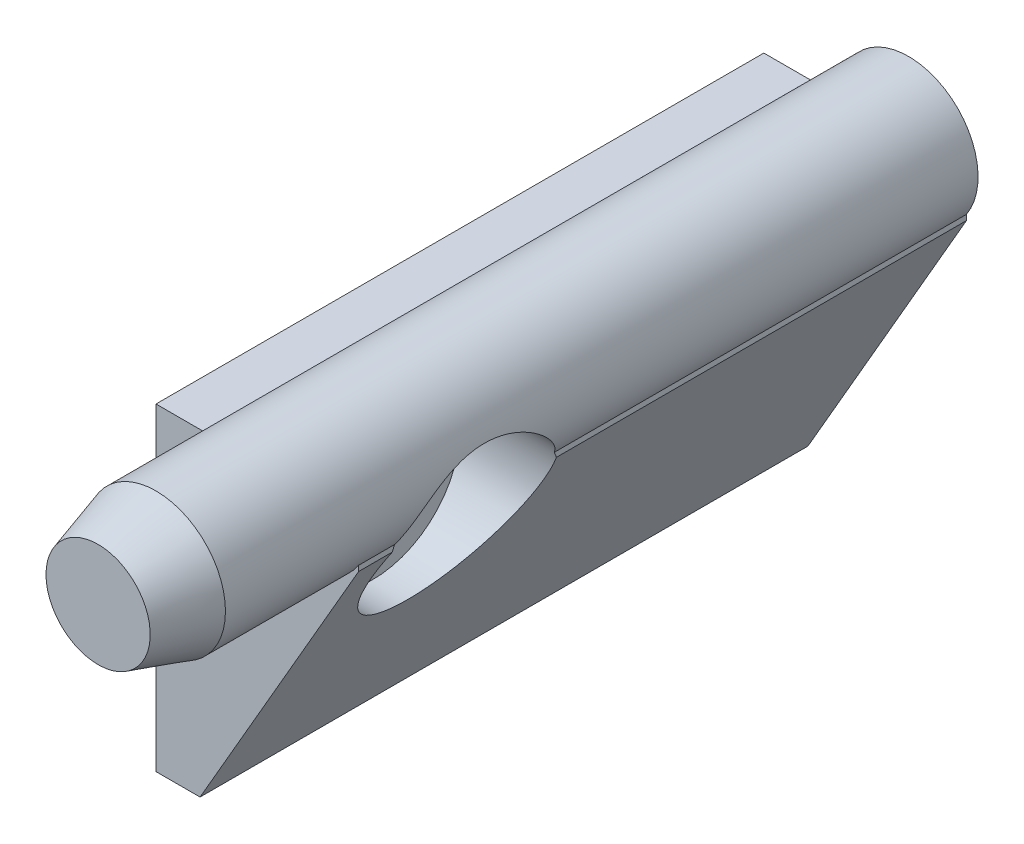
ISO-10303-21;
HEADER;
FILE_DESCRIPTION(('STEP AP214'),'2;1');
FILE_NAME('part.step','',(''),(''),'','','');
FILE_SCHEMA(('AUTOMOTIVE_DESIGN { 1 0 10303 214 1 1 1 1 }'));
ENDSEC;
DATA;
#1=APPLICATION_CONTEXT('core data for automotive mechanical design processes');
#2=APPLICATION_PROTOCOL_DEFINITION('international standard','automotive_design',2000,#1);
#3=PRODUCT_CONTEXT('',#1,'mechanical');
#4=PRODUCT('Part','Part','',(#3));
#5=PRODUCT_RELATED_PRODUCT_CATEGORY('part','',(#4));
#6=PRODUCT_DEFINITION_FORMATION('','',#4);
#7=PRODUCT_DEFINITION_CONTEXT('part definition',#1,'design');
#8=PRODUCT_DEFINITION('design','',#6,#7);
#9=PRODUCT_DEFINITION_SHAPE('','',#8);
#10=(LENGTH_UNIT() NAMED_UNIT(*) SI_UNIT(.MILLI.,.METRE.));
#11=(NAMED_UNIT(*) PLANE_ANGLE_UNIT() SI_UNIT($,.RADIAN.));
#12=(NAMED_UNIT(*) SI_UNIT($,.STERADIAN.) SOLID_ANGLE_UNIT());
#13=UNCERTAINTY_MEASURE_WITH_UNIT(LENGTH_MEASURE(1.E-05),#10,'distance_accuracy_value','');
#14=(GEOMETRIC_REPRESENTATION_CONTEXT(3) GLOBAL_UNCERTAINTY_ASSIGNED_CONTEXT((#13)) GLOBAL_UNIT_ASSIGNED_CONTEXT((#10,
#11,#12)) REPRESENTATION_CONTEXT('',''));
#15=CARTESIAN_POINT('',(0.,0.,0.));
#16=DIRECTION('',(0.,0.,1.));
#17=DIRECTION('',(1.,0.,0.));
#18=AXIS2_PLACEMENT_3D('',#15,#16,#17);
#19=CARTESIAN_POINT('',(-12.5,-2.5,17.));
#20=DIRECTION('',(1.,0.,0.));
#21=DIRECTION('',(0.,0.,-1.));
#22=AXIS2_PLACEMENT_3D('',#19,#20,#21);
#23=CYLINDRICAL_SURFACE('',#22,1.75);
#24=CARTESIAN_POINT('',(-1.5,-2.5,17.));
#25=DIRECTION('',(1.,0.,0.));
#26=DIRECTION('',(0.,0.,-1.));
#27=AXIS2_PLACEMENT_3D('',#24,#25,#26);
#28=CIRCLE('',#27,1.75);
#29=CARTESIAN_POINT('',(-1.5,-2.5,15.25));
#30=VERTEX_POINT('',#29);
#31=EDGE_CURVE('E92',#30,#30,#28,.F.);
#32=ORIENTED_EDGE('',*,*,#31,.F.);
#33=EDGE_LOOP('',(#32));
#34=FACE_BOUND('',#33,.T.);
#35=CARTESIAN_POINT('',(-5.,-2.5,17.));
#36=DIRECTION('',(1.,0.,0.));
#37=DIRECTION('',(0.,0.,-1.));
#38=AXIS2_PLACEMENT_3D('',#35,#36,#37);
#39=CIRCLE('',#38,1.75);
#40=CARTESIAN_POINT('',(-5.,-2.5,15.25));
#41=VERTEX_POINT('',#40);
#42=EDGE_CURVE('E106',#41,#41,#39,.F.);
#43=ORIENTED_EDGE('',*,*,#42,.T.);
#44=EDGE_LOOP('',(#43));
#45=FACE_BOUND('',#44,.T.);
#46=ADVANCED_FACE('F16',(#34,#45),#23,.F.);
#47=CARTESIAN_POINT('',(-5.,-11.,0.));
#48=DIRECTION('',(0.,1.,0.));
#49=DIRECTION('',(0.,0.,1.));
#50=AXIS2_PLACEMENT_3D('',#47,#48,#49);
#51=PLANE('',#50);
#52=DIRECTION('',(1.,0.,0.));
#53=VECTOR('',#52,1.);
#54=CARTESIAN_POINT('',(-5.,-11.,21.));
#55=LINE('',#54,#53);
#56=CARTESIAN_POINT('',(-5.,-11.,21.));
#57=VERTEX_POINT('',#56);
#58=CARTESIAN_POINT('',(-3.47735026918938,-11.0000000000004,21.));
#59=VERTEX_POINT('',#58);
#60=EDGE_CURVE('E74',#57,#59,#55,.T.);
#61=ORIENTED_EDGE('',*,*,#60,.F.);
#62=DIRECTION('',(0.,0.,-1.));
#63=VECTOR('',#62,1.);
#64=CARTESIAN_POINT('',(-5.,-11.,0.));
#65=LINE('',#64,#63);
#66=CARTESIAN_POINT('',(-5.,-11.,0.));
#67=VERTEX_POINT('',#66);
#68=EDGE_CURVE('E107',#57,#67,#65,.T.);
#69=ORIENTED_EDGE('',*,*,#68,.T.);
#70=DIRECTION('',(1.,0.,0.));
#71=VECTOR('',#70,1.);
#72=CARTESIAN_POINT('',(-5.,-11.,0.));
#73=LINE('',#72,#71);
#74=CARTESIAN_POINT('',(-3.47735026918876,-11.0000000000007,0.));
#75=VERTEX_POINT('',#74);
#76=EDGE_CURVE('E73',#67,#75,#73,.T.);
#77=ORIENTED_EDGE('',*,*,#76,.T.);
#78=DIRECTION('',(0.,0.,1.));
#79=VECTOR('',#78,1.);
#80=CARTESIAN_POINT('',(-3.47735026918815,-11.0000000000011,-1.));
#81=LINE('',#80,#79);
#82=EDGE_CURVE('E80',#75,#59,#81,.T.);
#83=ORIENTED_EDGE('',*,*,#82,.T.);
#84=EDGE_LOOP('',(#61,#69,#77,#83));
#85=FACE_BOUND('',#84,.T.);
#86=ADVANCED_FACE('F174',(#85),#51,.F.);
#87=CARTESIAN_POINT('',(2.,-11.,0.));
#88=DIRECTION('',(1.,0.,0.));
#89=DIRECTION('',(0.,0.,-1.));
#90=AXIS2_PLACEMENT_3D('',#87,#88,#89);
#91=PLANE('',#90);
#92=DIRECTION('',(0.,0.,1.));
#93=VECTOR('',#92,1.);
#94=CARTESIAN_POINT('',(2.00000000000007,-1.32664991614205,0.));
#95=LINE('',#94,#93);
#96=CARTESIAN_POINT('',(2.00000000000004,-1.32664991614211,14.2389767149278));
#97=VERTEX_POINT('',#96);
#98=CARTESIAN_POINT('',(2.,-1.32664991614208,0.));
#99=VERTEX_POINT('',#98);
#100=EDGE_CURVE('E60',#97,#99,#95,.F.);
#101=ORIENTED_EDGE('',*,*,#100,.F.);
#102=CARTESIAN_POINT('',(2.,-2.5,17.));
#103=DIRECTION('',(1.,0.,0.));
#104=DIRECTION('',(0.,0.,-1.));
#105=AXIS2_PLACEMENT_3D('',#102,#103,#104);
#106=CIRCLE('',#105,3.);
#107=CARTESIAN_POINT('',(2.00000000000172,-1.51295104291796,14.1670272934031));
#108=VERTEX_POINT('',#107);
#109=EDGE_CURVE('E19',#97,#108,#106,.F.);
#110=ORIENTED_EDGE('',*,*,#109,.T.);
#111=DIRECTION('',(0.,0.,1.));
#112=VECTOR('',#111,1.);
#113=CARTESIAN_POINT('',(2.00000000000343,-1.51295104291498,-1.));
#114=LINE('',#113,#112);
#115=CARTESIAN_POINT('',(2.00000000000229,-1.51295104291432,0.));
#116=VERTEX_POINT('',#115);
#117=EDGE_CURVE('E90',#108,#116,#114,.F.);
#118=ORIENTED_EDGE('',*,*,#117,.T.);
#119=DIRECTION('',(0.,1.,0.));
#120=VECTOR('',#119,1.);
#121=CARTESIAN_POINT('',(2.,-11.,0.));
#122=LINE('',#121,#120);
#123=EDGE_CURVE('E78',#116,#99,#122,.T.);
#124=ORIENTED_EDGE('',*,*,#123,.T.);
#125=EDGE_LOOP('',(#101,#110,#118,#124));
#126=FACE_BOUND('',#125,.T.);
#127=ADVANCED_FACE('F76',(#126),#91,.T.);
#128=CARTESIAN_POINT('',(-5.,-11.,0.));
#129=DIRECTION('',(1.,0.,0.));
#130=DIRECTION('',(0.,0.,-1.));
#131=AXIS2_PLACEMENT_3D('',#128,#129,#130);
#132=PLANE('',#131);
#133=ORIENTED_EDGE('',*,*,#42,.F.);
#134=EDGE_LOOP('',(#133));
#135=FACE_BOUND('',#134,.T.);
#136=DIRECTION('',(0.,0.,1.));
#137=VECTOR('',#136,1.);
#138=CARTESIAN_POINT('',(-5.,0.,0.));
#139=LINE('',#138,#137);
#140=CARTESIAN_POINT('',(-5.,0.,0.));
#141=VERTEX_POINT('',#140);
#142=CARTESIAN_POINT('',(-5.,0.,21.));
#143=VERTEX_POINT('',#142);
#144=EDGE_CURVE('E83',#141,#143,#139,.T.);
#145=ORIENTED_EDGE('',*,*,#144,.F.);
#146=DIRECTION('',(0.,1.,0.));
#147=VECTOR('',#146,1.);
#148=CARTESIAN_POINT('',(-5.,-11.,0.));
#149=LINE('',#148,#147);
#150=EDGE_CURVE('E103',#67,#141,#149,.T.);
#151=ORIENTED_EDGE('',*,*,#150,.F.);
#152=ORIENTED_EDGE('',*,*,#68,.F.);
#153=DIRECTION('',(0.,1.,0.));
#154=VECTOR('',#153,1.);
#155=CARTESIAN_POINT('',(-5.,-11.,21.));
#156=LINE('',#155,#154);
#157=EDGE_CURVE('E96',#143,#57,#156,.F.);
#158=ORIENTED_EDGE('',*,*,#157,.F.);
#159=EDGE_LOOP('',(#145,#151,#152,#158));
#160=FACE_BOUND('',#159,.T.);
#161=ADVANCED_FACE('F168',(#135,#160),#132,.F.);
#162=CARTESIAN_POINT('',(0.,0.,28.));
#163=DIRECTION('',(0.,0.,1.));
#164=DIRECTION('',(1.,0.,0.));
#165=AXIS2_PLACEMENT_3D('',#162,#163,#164);
#166=PLANE('',#165);
#167=CARTESIAN_POINT('',(0.,0.,27.9999999999632));
#168=DIRECTION('',(0.,0.,-1.));
#169=DIRECTION('',(-1.,0.,0.));
#170=AXIS2_PLACEMENT_3D('',#167,#168,#169);
#171=CIRCLE('',#170,1.8000000000427);
#172=CARTESIAN_POINT('',(-1.8000000000427,0.,27.9999999999632));
#173=VERTEX_POINT('',#172);
#174=EDGE_CURVE('E212',#173,#173,#171,.T.);
#175=ORIENTED_EDGE('',*,*,#174,.F.);
#176=EDGE_LOOP('',(#175));
#177=FACE_BOUND('',#176,.T.);
#178=ADVANCED_FACE('F164',(#177),#166,.T.);
#179=CARTESIAN_POINT('',(-1.5,-2.5,17.));
#180=DIRECTION('',(1.,0.,0.));
#181=DIRECTION('',(0.,0.,-1.));
#182=AXIS2_PLACEMENT_3D('',#179,#180,#181);
#183=PLANE('',#182);
#184=ORIENTED_EDGE('',*,*,#31,.T.);
#185=EDGE_LOOP('',(#184));
#186=FACE_BOUND('',#185,.T.);
#187=CARTESIAN_POINT('',(-1.5,-2.5,17.));
#188=DIRECTION('',(1.,0.,0.));
#189=DIRECTION('',(0.,0.,-1.));
#190=AXIS2_PLACEMENT_3D('',#187,#188,#189);
#191=CIRCLE('',#190,3.);
#192=CARTESIAN_POINT('',(-1.5,-2.5,14.));
#193=VERTEX_POINT('',#192);
#194=EDGE_CURVE('E209',#193,#193,#191,.T.);
#195=ORIENTED_EDGE('',*,*,#194,.T.);
#196=EDGE_LOOP('',(#195));
#197=FACE_BOUND('',#196,.T.);
#198=ADVANCED_FACE('F160',(#186,#197),#183,.T.);
#199=CARTESIAN_POINT('',(-7.230127018922,-17.5,-1.));
#200=DIRECTION('',(-0.866025403784329,0.50000000000019,0.));
#201=DIRECTION('',(-0.50000000000019,-0.866025403784329,0.));
#202=AXIS2_PLACEMENT_3D('',#199,#200,#201);
#203=PLANE('',#202);
#204=DIRECTION('',(0.500000000000045,0.866025403784413,0.));
#205=VECTOR('',#204,1.);
#206=CARTESIAN_POINT('',(-3.47735026919,-11.,21.));
#207=LINE('',#206,#205);
#208=CARTESIAN_POINT('',(2.,-1.512951042913,21.));
#209=VERTEX_POINT('',#208);
#210=EDGE_CURVE('E93',#59,#209,#207,.T.);
#211=ORIENTED_EDGE('',*,*,#210,.F.);
#212=ORIENTED_EDGE('',*,*,#82,.F.);
#213=DIRECTION('',(-0.50000000000019,-0.866025403784329,0.));
#214=VECTOR('',#213,1.);
#215=CARTESIAN_POINT('',(-7.230127018922,-17.5,0.));
#216=LINE('',#215,#214);
#217=EDGE_CURVE('E86',#116,#75,#216,.T.);
#218=ORIENTED_EDGE('',*,*,#217,.F.);
#219=ORIENTED_EDGE('',*,*,#117,.F.);
#220=CARTESIAN_POINT('',(1.43012701892677,-2.5,17.));
#221=DIRECTION('',(-0.866025403784329,0.50000000000019,0.));
#222=DIRECTION('',(0.50000000000019,0.866025403784329,0.));
#223=AXIS2_PLACEMENT_3D('',#220,#221,#222);
#224=ELLIPSE('',#223,3.46410161513819,3.);
#225=CARTESIAN_POINT('',(2.,-1.51295104291697,19.8329727065966));
#226=VERTEX_POINT('',#225);
#227=EDGE_CURVE('E69',#108,#226,#224,.T.);
#228=ORIENTED_EDGE('',*,*,#227,.T.);
#229=DIRECTION('',(0.,0.,-1.));
#230=VECTOR('',#229,1.);
#231=CARTESIAN_POINT('',(2.,-1.512951042913,0.));
#232=LINE('',#231,#230);
#233=EDGE_CURVE('E214',#209,#226,#232,.T.);
#234=ORIENTED_EDGE('',*,*,#233,.F.);
#235=EDGE_LOOP('',(#211,#212,#218,#219,#228,#234));
#236=FACE_BOUND('',#235,.T.);
#237=ADVANCED_FACE('F156',(#236),#203,.F.);
#238=CARTESIAN_POINT('',(0.,0.,0.));
#239=DIRECTION('',(0.,0.,1.));
#240=DIRECTION('',(1.,0.,0.));
#241=AXIS2_PLACEMENT_3D('',#238,#239,#240);
#242=PLANE('',#241);
#243=CARTESIAN_POINT('',(0.,0.,0.));
#244=DIRECTION('',(0.,0.,1.));
#245=DIRECTION('',(1.,0.,0.));
#246=AXIS2_PLACEMENT_3D('',#243,#244,#245);
#247=CIRCLE('',#246,2.4);
#248=CARTESIAN_POINT('',(-2.4,0.,0.));
#249=VERTEX_POINT('',#248);
#250=EDGE_CURVE('E205',#99,#249,#247,.T.);
#251=ORIENTED_EDGE('',*,*,#250,.F.);
#252=ORIENTED_EDGE('',*,*,#123,.F.);
#253=ORIENTED_EDGE('',*,*,#217,.T.);
#254=ORIENTED_EDGE('',*,*,#76,.F.);
#255=ORIENTED_EDGE('',*,*,#150,.T.);
#256=DIRECTION('',(1.,0.,0.));
#257=VECTOR('',#256,1.);
#258=CARTESIAN_POINT('',(-5.,0.,0.));
#259=LINE('',#258,#257);
#260=EDGE_CURVE('E79',#249,#141,#259,.F.);
#261=ORIENTED_EDGE('',*,*,#260,.F.);
#262=EDGE_LOOP('',(#251,#252,#253,#254,#255,#261));
#263=FACE_BOUND('',#262,.T.);
#264=ADVANCED_FACE('F152',(#263),#242,.F.);
#265=CARTESIAN_POINT('',(-5.,0.,0.));
#266=DIRECTION('',(0.,1.,0.));
#267=DIRECTION('',(0.,0.,1.));
#268=AXIS2_PLACEMENT_3D('',#265,#266,#267);
#269=PLANE('',#268);
#270=DIRECTION('',(1.,0.,0.));
#271=VECTOR('',#270,1.);
#272=CARTESIAN_POINT('',(-5.,0.,21.));
#273=LINE('',#272,#271);
#274=CARTESIAN_POINT('',(-2.4,0.,21.));
#275=VERTEX_POINT('',#274);
#276=EDGE_CURVE('E100',#275,#143,#273,.F.);
#277=ORIENTED_EDGE('',*,*,#276,.F.);
#278=DIRECTION('',(0.,0.,1.));
#279=VECTOR('',#278,1.);
#280=CARTESIAN_POINT('',(-2.4,1.13270210217651E-13,0.));
#281=LINE('',#280,#279);
#282=EDGE_CURVE('E204',#249,#275,#281,.T.);
#283=ORIENTED_EDGE('',*,*,#282,.F.);
#284=ORIENTED_EDGE('',*,*,#260,.T.);
#285=ORIENTED_EDGE('',*,*,#144,.T.);
#286=EDGE_LOOP('',(#277,#283,#284,#285));
#287=FACE_BOUND('',#286,.T.);
#288=ADVANCED_FACE('F148',(#287),#269,.T.);
#289=CARTESIAN_POINT('',(-5.,-11.,21.));
#290=DIRECTION('',(0.,0.,1.));
#291=DIRECTION('',(1.,0.,0.));
#292=AXIS2_PLACEMENT_3D('',#289,#290,#291);
#293=PLANE('',#292);
#294=DIRECTION('',(0.,1.,0.));
#295=VECTOR('',#294,1.);
#296=CARTESIAN_POINT('',(2.,-11.,21.));
#297=LINE('',#296,#295);
#298=CARTESIAN_POINT('',(2.00000000000004,-1.3266499161421,21.));
#299=VERTEX_POINT('',#298);
#300=EDGE_CURVE('E95',#299,#209,#297,.F.);
#301=ORIENTED_EDGE('',*,*,#300,.F.);
#302=CARTESIAN_POINT('',(0.,0.,21.));
#303=DIRECTION('',(0.,0.,1.));
#304=DIRECTION('',(1.,0.,0.));
#305=AXIS2_PLACEMENT_3D('',#302,#303,#304);
#306=CIRCLE('',#305,2.4);
#307=EDGE_CURVE('E122',#275,#299,#306,.T.);
#308=ORIENTED_EDGE('',*,*,#307,.F.);
#309=ORIENTED_EDGE('',*,*,#276,.T.);
#310=ORIENTED_EDGE('',*,*,#157,.T.);
#311=ORIENTED_EDGE('',*,*,#60,.T.);
#312=ORIENTED_EDGE('',*,*,#210,.T.);
#313=EDGE_LOOP('',(#301,#308,#309,#310,#311,#312));
#314=FACE_BOUND('',#313,.T.);
#315=ADVANCED_FACE('F142',(#314),#293,.T.);
#316=CARTESIAN_POINT('',(2.,-11.,0.));
#317=DIRECTION('',(1.,0.,0.));
#318=DIRECTION('',(0.,0.,-1.));
#319=AXIS2_PLACEMENT_3D('',#316,#317,#318);
#320=PLANE('',#319);
#321=CARTESIAN_POINT('',(2.,-2.5,17.));
#322=DIRECTION('',(1.,0.,0.));
#323=DIRECTION('',(0.,0.,-1.));
#324=AXIS2_PLACEMENT_3D('',#321,#322,#323);
#325=CIRCLE('',#324,3.);
#326=CARTESIAN_POINT('',(2.00000000000005,-1.32664991614209,19.7610232850722));
#327=VERTEX_POINT('',#326);
#328=EDGE_CURVE('E34',#226,#327,#325,.F.);
#329=ORIENTED_EDGE('',*,*,#328,.T.);
#330=DIRECTION('',(0.,0.,1.));
#331=VECTOR('',#330,1.);
#332=CARTESIAN_POINT('',(2.00000000000007,-1.32664991614205,0.));
#333=LINE('',#332,#331);
#334=EDGE_CURVE('E62',#299,#327,#333,.F.);
#335=ORIENTED_EDGE('',*,*,#334,.F.);
#336=ORIENTED_EDGE('',*,*,#300,.T.);
#337=ORIENTED_EDGE('',*,*,#233,.T.);
#338=EDGE_LOOP('',(#329,#335,#336,#337));
#339=FACE_BOUND('',#338,.T.);
#340=ADVANCED_FACE('F137',(#339),#320,.T.);
#341=CARTESIAN_POINT('',(0.,0.,26.0000000001241));
#342=DIRECTION('',(0.,0.,-1.));
#343=DIRECTION('',(-1.,0.,0.));
#344=AXIS2_PLACEMENT_3D('',#341,#342,#343);
#345=CONICAL_SURFACE('',#344,2.39999999996598,0.29145679446483);
#346=ORIENTED_EDGE('',*,*,#174,.T.);
#347=EDGE_LOOP('',(#346));
#348=FACE_BOUND('',#347,.T.);
#349=CARTESIAN_POINT('',(0.,0.,26.));
#350=DIRECTION('',(0.,0.,1.));
#351=DIRECTION('',(1.,0.,0.));
#352=AXIS2_PLACEMENT_3D('',#349,#350,#351);
#353=CIRCLE('',#352,2.4);
#354=CARTESIAN_POINT('',(2.4,0.,26.));
#355=VERTEX_POINT('',#354);
#356=EDGE_CURVE('E11',#355,#355,#353,.F.);
#357=ORIENTED_EDGE('',*,*,#356,.F.);
#358=EDGE_LOOP('',(#357));
#359=FACE_BOUND('',#358,.T.);
#360=ADVANCED_FACE('F133',(#348,#359),#345,.T.);
#361=CARTESIAN_POINT('',(-1.5,-2.5,17.));
#362=DIRECTION('',(1.,0.,0.));
#363=DIRECTION('',(0.,0.,-1.));
#364=AXIS2_PLACEMENT_3D('',#361,#362,#363);
#365=CYLINDRICAL_SURFACE('',#364,3.);
#366=ORIENTED_EDGE('',*,*,#227,.F.);
#367=ORIENTED_EDGE('',*,*,#109,.F.);
#368=CARTESIAN_POINT('',(2.0000000000001,-1.32664991614201,19.7610232850721));
#369=CARTESIAN_POINT('',(2.03181216276641,-1.27872020693926,19.7406705305906));
#370=CARTESIAN_POINT('',(2.06152359410878,-1.23015936678912,19.71854508503));
#371=CARTESIAN_POINT('',(2.11675818650148,-1.1324581217235,19.6707232814315));
#372=CARTESIAN_POINT('',(2.14228362801012,-1.08331804811076,19.6450288818879));
#373=CARTESIAN_POINT('',(2.18905439011479,-0.98537985499484,19.590185353522));
#374=CARTESIAN_POINT('',(2.21032430746052,-0.936581442607327,19.5610577218539));
#375=CARTESIAN_POINT('',(2.24893276740003,-0.839657939806004,19.4993145452937));
#376=CARTESIAN_POINT('',(2.26627114873424,-0.791532877086874,19.4666988574128));
#377=CARTESIAN_POINT('',(2.312682249787,-0.649175517732779,19.363911270644));
#378=CARTESIAN_POINT('',(2.33625660812486,-0.556730291190513,19.2886716162666));
#379=CARTESIAN_POINT('',(2.37136992567631,-0.380420933834681,19.1264455771947));
#380=CARTESIAN_POINT('',(2.3829088320942,-0.29655684066527,19.0394591409727));
#381=CARTESIAN_POINT('',(2.3936419054499,-0.178959056095024,18.9016907523925));
#382=CARTESIAN_POINT('',(2.39612379905799,-0.141129690132717,18.8545584401193));
#383=CARTESIAN_POINT('',(2.39930258636172,-0.0683596463815841,18.7580593896598));
#384=CARTESIAN_POINT('',(2.39999970316051,-0.0334186080704732,18.7086929315344));
#385=CARTESIAN_POINT('',(2.40000041118645,0.0462919495937435,18.5885245319426));
#386=CARTESIAN_POINT('',(2.39866375032125,0.0896626296425245,18.5167908351488));
#387=CARTESIAN_POINT('',(2.39429491811587,0.170235820744032,18.3699838864138));
#388=CARTESIAN_POINT('',(2.39126238576786,0.207437016283812,18.2949099265488));
#389=CARTESIAN_POINT('',(2.38438330488101,0.27547937958487,18.1418148855415));
#390=CARTESIAN_POINT('',(2.38053538962029,0.306309695104056,18.0637890392026));
#391=CARTESIAN_POINT('',(2.37280779262276,0.361319388882437,17.9054698479238));
#392=CARTESIAN_POINT('',(2.36892812201516,0.385501002475778,17.8251772751069));
#393=CARTESIAN_POINT('',(2.36003042190297,0.437343357112819,17.6226457804407));
#394=CARTESIAN_POINT('',(2.35539763528637,0.460815445859722,17.4992909195609));
#395=CARTESIAN_POINT('',(2.349055607367,0.49213769020753,17.2506083873713));
#396=CARTESIAN_POINT('',(2.34734453850276,0.499997611866067,17.1252819988249));
#397=CARTESIAN_POINT('',(2.34733515735076,0.500001598498809,16.9161424227299));
#398=CARTESIAN_POINT('',(2.34809548857108,0.496482784799095,16.832304733395));
#399=CARTESIAN_POINT('',(2.35102260833485,0.482439640322397,16.6652147861817));
#400=CARTESIAN_POINT('',(2.35318972299712,0.471913685143962,16.5819626685743));
#401=CARTESIAN_POINT('',(2.35862821492258,0.443931126634806,16.4166482145404));
#402=CARTESIAN_POINT('',(2.36189986771845,0.426472793795426,16.3345861803186));
#403=CARTESIAN_POINT('',(2.36905186573995,0.384758182353309,16.1722311302106));
#404=CARTESIAN_POINT('',(2.37293233618801,0.360500504443025,16.0919384821373));
#405=CARTESIAN_POINT('',(2.38256777180132,0.291737487990668,15.8946318674792));
#406=CARTESIAN_POINT('',(2.38830452817648,0.243144337117455,15.7790117258193));
#407=CARTESIAN_POINT('',(2.39702133500311,0.131897509473511,15.5547315103862));
#408=CARTESIAN_POINT('',(2.40000257763516,0.0692499279839411,15.446068445572));
#409=CARTESIAN_POINT('',(2.39999719488886,-0.075361225666052,15.228095167632));
#410=CARTESIAN_POINT('',(2.39646068784826,-0.158541529713801,15.1195741161432));
#411=CARTESIAN_POINT('',(2.38243531450169,-0.293332834857073,14.9664621764387));
#412=CARTESIAN_POINT('',(2.37629943798046,-0.339969381137397,14.9170054101728));
#413=CARTESIAN_POINT('',(2.36053424761842,-0.436179211171605,14.8216474676506));
#414=CARTESIAN_POINT('',(2.35090662621328,-0.485751062470836,14.775744581899));
#415=CARTESIAN_POINT('',(2.3274914900282,-0.587836996764127,14.6873743580461));
#416=CARTESIAN_POINT('',(2.31366341023562,-0.64037550988577,14.6449458876408));
#417=CARTESIAN_POINT('',(2.28138903004839,-0.747245863432031,14.5643630702284));
#418=CARTESIAN_POINT('',(2.26294529065279,-0.801576694923396,14.5262063699656));
#419=CARTESIAN_POINT('',(2.2210922356681,-0.911142627923987,14.4544524615676));
#420=CARTESIAN_POINT('',(2.19769387523265,-0.966375490297486,14.4208454580386));
#421=CARTESIAN_POINT('',(2.14567420322606,-1.07694380567303,14.3582313264617));
#422=CARTESIAN_POINT('',(2.11705716271312,-1.13227913842019,14.3292204728649));
#423=CARTESIAN_POINT('',(2.07245538270066,-1.21064406493652,14.2910806328818));
#424=CARTESIAN_POINT('',(2.05862631583877,-1.23401946550075,14.2800832327567));
#425=CARTESIAN_POINT('',(2.03002350430336,-1.28052674710823,14.2589169063211));
#426=CARTESIAN_POINT('',(2.01525078941542,-1.30365886257969,14.2487471035343));
#427=CARTESIAN_POINT('',(2.00000000000021,-1.32664991614203,14.2389767149278));
#428=B_SPLINE_CURVE_WITH_KNOTS('',3,(#368,#369,#370,#371,#372,#373,#374,#375,#376,#377,#378,
#379,#380,#381,#382,#383,#384,#385,#386,#387,#388,#389,#390,#391,#392,#393,#394,#395,#396,#397,
#398,#399,#400,#401,#402,#403,#404,#405,#406,#407,#408,#409,#410,#411,#412,#413,#414,#415,#416,
#417,#418,#419,#420,#421,#422,#423,#424,#425,#426,#427),.UNSPECIFIED.,.F.,.F.,(4,2,2,2,2,2,2,2,
2,2,2,2,2,2,2,2,2,2,2,2,2,2,2,2,2,2,2,2,2,4),(0.,0.182985692375831,0.365871363596514,
0.54766731526279,0.729470722294326,1.09223714459514,1.45500515823006,1.63635150360431,
1.81767517896286,2.06884741277372,2.32007313511641,2.57172333382809,2.82328882246272,
3.19920351555845,3.57488298428369,3.82634425064993,4.07786383128858,4.32944620118935,
4.58108038489114,4.95666572708281,5.33208849507761,5.74064227646903,5.94520422478646,
6.14966715491125,6.35617104721209,6.56256061386949,6.768498511142,6.97426861556038,
7.06215105881324,7.14993918395595),.UNSPECIFIED.);
#429=EDGE_CURVE('E25',#327,#97,#428,.T.);
#430=ORIENTED_EDGE('',*,*,#429,.F.);
#431=ORIENTED_EDGE('',*,*,#328,.F.);
#432=EDGE_LOOP('',(#366,#367,#430,#431));
#433=FACE_BOUND('',#432,.T.);
#434=ORIENTED_EDGE('',*,*,#194,.F.);
#435=EDGE_LOOP('',(#434));
#436=FACE_BOUND('',#435,.T.);
#437=ADVANCED_FACE('F67',(#433,#436),#365,.F.);
#438=CARTESIAN_POINT('',(0.,0.,0.));
#439=DIRECTION('',(0.,0.,1.));
#440=DIRECTION('',(1.,0.,0.));
#441=AXIS2_PLACEMENT_3D('',#438,#439,#440);
#442=CYLINDRICAL_SURFACE('',#441,2.4);
#443=ORIENTED_EDGE('',*,*,#356,.T.);
#444=EDGE_LOOP('',(#443));
#445=FACE_BOUND('',#444,.T.);
#446=ORIENTED_EDGE('',*,*,#429,.T.);
#447=ORIENTED_EDGE('',*,*,#100,.T.);
#448=ORIENTED_EDGE('',*,*,#250,.T.);
#449=ORIENTED_EDGE('',*,*,#282,.T.);
#450=ORIENTED_EDGE('',*,*,#307,.T.);
#451=ORIENTED_EDGE('',*,*,#334,.T.);
#452=EDGE_LOOP('',(#446,#447,#448,#449,#450,#451));
#453=FACE_BOUND('',#452,.T.);
#454=ADVANCED_FACE('F57',(#445,#453),#442,.T.);
#455=CLOSED_SHELL('',(#46,#86,#127,#161,#178,#198,#237,#264,#288,#315,#340,#360,#437,#454));
#456=MANIFOLD_SOLID_BREP('B1',#455);
#457=ADVANCED_BREP_SHAPE_REPRESENTATION('',(#18,#456),#14);
#458=SHAPE_DEFINITION_REPRESENTATION(#9,#457);
ENDSEC;
END-ISO-10303-21;
